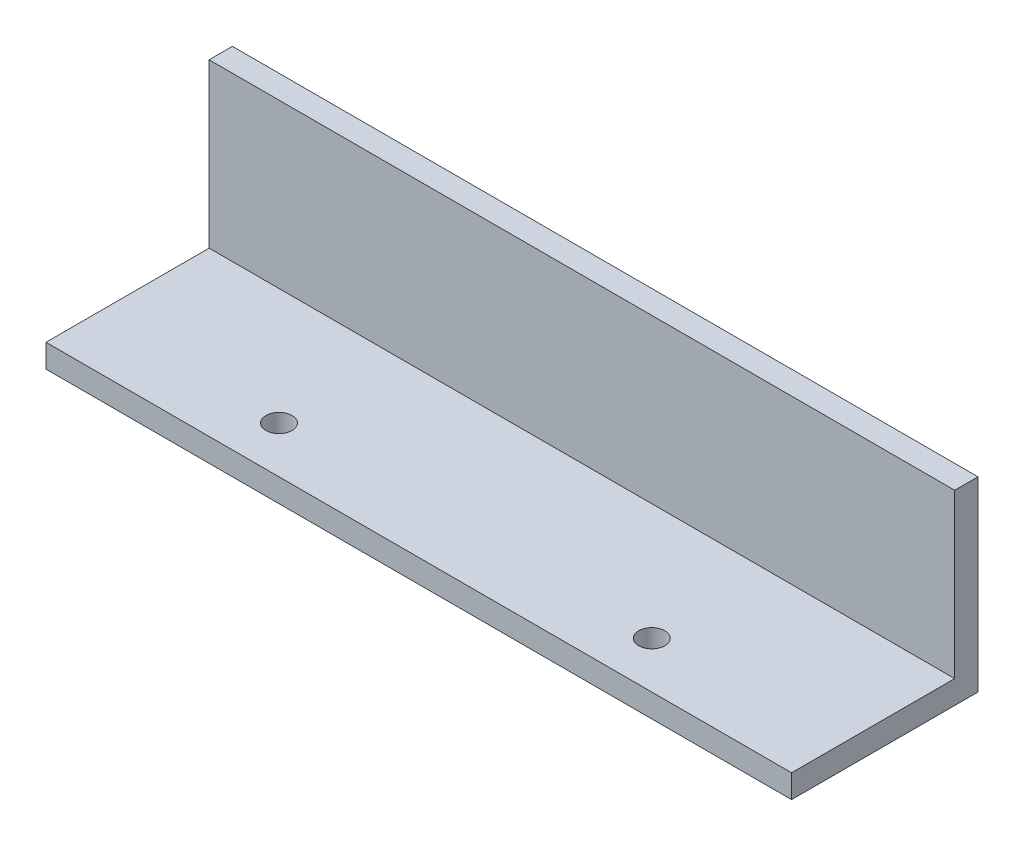
ISO-10303-21;
HEADER;
FILE_DESCRIPTION(('STEP AP214'),'2;1');
FILE_NAME('part.step','',(''),(''),'','','');
FILE_SCHEMA(('AUTOMOTIVE_DESIGN { 1 0 10303 214 1 1 1 1 }'));
ENDSEC;
DATA;
#1=APPLICATION_CONTEXT('core data for automotive mechanical design processes');
#2=APPLICATION_PROTOCOL_DEFINITION('international standard','automotive_design',2000,#1);
#3=PRODUCT_CONTEXT('',#1,'mechanical');
#4=PRODUCT('Part','Part','',(#3));
#5=PRODUCT_RELATED_PRODUCT_CATEGORY('part','',(#4));
#6=PRODUCT_DEFINITION_FORMATION('','',#4);
#7=PRODUCT_DEFINITION_CONTEXT('part definition',#1,'design');
#8=PRODUCT_DEFINITION('design','',#6,#7);
#9=PRODUCT_DEFINITION_SHAPE('','',#8);
#10=(LENGTH_UNIT() NAMED_UNIT(*) SI_UNIT(.MILLI.,.METRE.));
#11=(NAMED_UNIT(*) PLANE_ANGLE_UNIT() SI_UNIT($,.RADIAN.));
#12=(NAMED_UNIT(*) SI_UNIT($,.STERADIAN.) SOLID_ANGLE_UNIT());
#13=UNCERTAINTY_MEASURE_WITH_UNIT(LENGTH_MEASURE(1.E-05),#10,'distance_accuracy_value','');
#14=(GEOMETRIC_REPRESENTATION_CONTEXT(3) GLOBAL_UNCERTAINTY_ASSIGNED_CONTEXT((#13)) GLOBAL_UNIT_ASSIGNED_CONTEXT((#10,
#11,#12)) REPRESENTATION_CONTEXT('',''));
#15=CARTESIAN_POINT('',(0.,0.,0.));
#16=DIRECTION('',(0.,0.,1.));
#17=DIRECTION('',(1.,0.,0.));
#18=AXIS2_PLACEMENT_3D('',#15,#16,#17);
#19=CARTESIAN_POINT('',(0.,3.175,0.));
#20=DIRECTION('',(0.,-1.,0.));
#21=DIRECTION('',(0.,0.,-1.));
#22=AXIS2_PLACEMENT_3D('',#19,#20,#21);
#23=PLANE('',#22);
#24=CARTESIAN_POINT('',(25.4,3.175,-31.75));
#25=DIRECTION('',(0.,-1.,0.));
#26=DIRECTION('',(0.,0.,-1.));
#27=AXIS2_PLACEMENT_3D('',#24,#25,#26);
#28=CIRCLE('',#27,1.778);
#29=CARTESIAN_POINT('',(25.4,3.175,-33.528));
#30=VERTEX_POINT('',#29);
#31=EDGE_CURVE('E148',#30,#30,#28,.T.);
#32=ORIENTED_EDGE('',*,*,#31,.T.);
#33=EDGE_LOOP('',(#32));
#34=FACE_BOUND('',#33,.T.);
#35=CARTESIAN_POINT('',(76.2,3.175,-31.75));
#36=DIRECTION('',(0.,-1.,0.));
#37=DIRECTION('',(0.,0.,-1.));
#38=AXIS2_PLACEMENT_3D('',#35,#36,#37);
#39=CIRCLE('',#38,1.77800000000001);
#40=CARTESIAN_POINT('',(76.2,3.175,-33.528));
#41=VERTEX_POINT('',#40);
#42=EDGE_CURVE('E154',#41,#41,#39,.T.);
#43=ORIENTED_EDGE('',*,*,#42,.T.);
#44=EDGE_LOOP('',(#43));
#45=FACE_BOUND('',#44,.T.);
#46=DIRECTION('',(-1.,0.,0.));
#47=VECTOR('',#46,1.);
#48=CARTESIAN_POINT('',(101.6,3.175,-25.4));
#49=LINE('',#48,#47);
#50=CARTESIAN_POINT('',(101.6,3.175,-25.4));
#51=VERTEX_POINT('',#50);
#52=CARTESIAN_POINT('',(0.,3.175,-25.4));
#53=VERTEX_POINT('',#52);
#54=EDGE_CURVE('E93',#51,#53,#49,.T.);
#55=ORIENTED_EDGE('',*,*,#54,.F.);
#56=DIRECTION('',(0.,0.,-1.));
#57=VECTOR('',#56,1.);
#58=CARTESIAN_POINT('',(101.6,3.175,0.));
#59=LINE('',#58,#57);
#60=CARTESIAN_POINT('',(101.6,3.175,-47.625));
#61=VERTEX_POINT('',#60);
#62=EDGE_CURVE('E39',#51,#61,#59,.T.);
#63=ORIENTED_EDGE('',*,*,#62,.T.);
#64=DIRECTION('',(1.,0.,0.));
#65=VECTOR('',#64,1.);
#66=CARTESIAN_POINT('',(0.,3.175,-47.625));
#67=LINE('',#66,#65);
#68=CARTESIAN_POINT('',(0.,3.175,-47.625));
#69=VERTEX_POINT('',#68);
#70=EDGE_CURVE('E61',#69,#61,#67,.T.);
#71=ORIENTED_EDGE('',*,*,#70,.F.);
#72=DIRECTION('',(0.,0.,1.));
#73=VECTOR('',#72,1.);
#74=CARTESIAN_POINT('',(0.,3.175,0.));
#75=LINE('',#74,#73);
#76=EDGE_CURVE('E99',#69,#53,#75,.T.);
#77=ORIENTED_EDGE('',*,*,#76,.T.);
#78=EDGE_LOOP('',(#55,#63,#71,#77));
#79=FACE_BOUND('',#78,.T.);
#80=ADVANCED_FACE('F35',(#34,#45,#79),#23,.F.);
#81=CARTESIAN_POINT('',(0.,3.175,0.));
#82=DIRECTION('',(1.,0.,0.));
#83=DIRECTION('',(0.,0.,-1.));
#84=AXIS2_PLACEMENT_3D('',#81,#82,#83);
#85=PLANE('',#84);
#86=DIRECTION('',(0.,-1.,0.));
#87=VECTOR('',#86,1.);
#88=CARTESIAN_POINT('',(0.,0.,-25.4));
#89=LINE('',#88,#87);
#90=CARTESIAN_POINT('',(0.,0.,-25.4));
#91=VERTEX_POINT('',#90);
#92=EDGE_CURVE('E53',#53,#91,#89,.T.);
#93=ORIENTED_EDGE('',*,*,#92,.F.);
#94=ORIENTED_EDGE('',*,*,#76,.F.);
#95=DIRECTION('',(0.,-1.,0.));
#96=VECTOR('',#95,1.);
#97=CARTESIAN_POINT('',(0.,25.4,-47.625));
#98=LINE('',#97,#96);
#99=CARTESIAN_POINT('',(0.,25.4,-47.625));
#100=VERTEX_POINT('',#99);
#101=EDGE_CURVE('E124',#100,#69,#98,.T.);
#102=ORIENTED_EDGE('',*,*,#101,.F.);
#103=DIRECTION('',(0.,0.,1.));
#104=VECTOR('',#103,1.);
#105=CARTESIAN_POINT('',(0.,25.4,-50.8));
#106=LINE('',#105,#104);
#107=CARTESIAN_POINT('',(0.,25.4,-50.8));
#108=VERTEX_POINT('',#107);
#109=EDGE_CURVE('E139',#108,#100,#106,.T.);
#110=ORIENTED_EDGE('',*,*,#109,.F.);
#111=DIRECTION('',(0.,-1.,0.));
#112=VECTOR('',#111,1.);
#113=CARTESIAN_POINT('',(0.,3.175,-50.8));
#114=LINE('',#113,#112);
#115=CARTESIAN_POINT('',(0.,0.,-50.8));
#116=VERTEX_POINT('',#115);
#117=EDGE_CURVE('E45',#108,#116,#114,.T.);
#118=ORIENTED_EDGE('',*,*,#117,.T.);
#119=DIRECTION('',(0.,0.,1.));
#120=VECTOR('',#119,1.);
#121=CARTESIAN_POINT('',(0.,0.,0.));
#122=LINE('',#121,#120);
#123=EDGE_CURVE('E121',#116,#91,#122,.T.);
#124=ORIENTED_EDGE('',*,*,#123,.T.);
#125=EDGE_LOOP('',(#93,#94,#102,#110,#118,#124));
#126=FACE_BOUND('',#125,.T.);
#127=ADVANCED_FACE('F37',(#126),#85,.F.);
#128=CARTESIAN_POINT('',(101.6,3.175,0.));
#129=DIRECTION('',(-1.,0.,0.));
#130=DIRECTION('',(0.,0.,1.));
#131=AXIS2_PLACEMENT_3D('',#128,#129,#130);
#132=PLANE('',#131);
#133=DIRECTION('',(0.,1.,0.));
#134=VECTOR('',#133,1.);
#135=CARTESIAN_POINT('',(101.6,0.,-25.4));
#136=LINE('',#135,#134);
#137=CARTESIAN_POINT('',(101.6,0.,-25.4));
#138=VERTEX_POINT('',#137);
#139=EDGE_CURVE('E90',#138,#51,#136,.T.);
#140=ORIENTED_EDGE('',*,*,#139,.F.);
#141=DIRECTION('',(0.,0.,-1.));
#142=VECTOR('',#141,1.);
#143=CARTESIAN_POINT('',(101.6,0.,0.));
#144=LINE('',#143,#142);
#145=CARTESIAN_POINT('',(101.6,0.,-50.8));
#146=VERTEX_POINT('',#145);
#147=EDGE_CURVE('E110',#138,#146,#144,.T.);
#148=ORIENTED_EDGE('',*,*,#147,.T.);
#149=DIRECTION('',(0.,-1.,0.));
#150=VECTOR('',#149,1.);
#151=CARTESIAN_POINT('',(101.6,3.175,-50.8));
#152=LINE('',#151,#150);
#153=CARTESIAN_POINT('',(101.6,25.4,-50.8));
#154=VERTEX_POINT('',#153);
#155=EDGE_CURVE('E11',#154,#146,#152,.T.);
#156=ORIENTED_EDGE('',*,*,#155,.F.);
#157=DIRECTION('',(0.,0.,-1.));
#158=VECTOR('',#157,1.);
#159=CARTESIAN_POINT('',(101.6,25.4,-50.8));
#160=LINE('',#159,#158);
#161=CARTESIAN_POINT('',(101.6,25.4,-47.625));
#162=VERTEX_POINT('',#161);
#163=EDGE_CURVE('E142',#162,#154,#160,.T.);
#164=ORIENTED_EDGE('',*,*,#163,.F.);
#165=DIRECTION('',(0.,-1.,0.));
#166=VECTOR('',#165,1.);
#167=CARTESIAN_POINT('',(101.6,25.4,-47.625));
#168=LINE('',#167,#166);
#169=EDGE_CURVE('E105',#162,#61,#168,.T.);
#170=ORIENTED_EDGE('',*,*,#169,.T.);
#171=ORIENTED_EDGE('',*,*,#62,.F.);
#172=EDGE_LOOP('',(#140,#148,#156,#164,#170,#171));
#173=FACE_BOUND('',#172,.T.);
#174=ADVANCED_FACE('F102',(#173),#132,.F.);
#175=CARTESIAN_POINT('',(0.,0.,0.));
#176=DIRECTION('',(0.,-1.,0.));
#177=DIRECTION('',(0.,0.,-1.));
#178=AXIS2_PLACEMENT_3D('',#175,#176,#177);
#179=PLANE('',#178);
#180=CARTESIAN_POINT('',(76.2,0.,-31.75));
#181=DIRECTION('',(0.,-1.,0.));
#182=DIRECTION('',(0.,0.,-1.));
#183=AXIS2_PLACEMENT_3D('',#180,#181,#182);
#184=CIRCLE('',#183,1.77800000000001);
#185=CARTESIAN_POINT('',(76.2,0.,-33.528));
#186=VERTEX_POINT('',#185);
#187=EDGE_CURVE('E157',#186,#186,#184,.T.);
#188=ORIENTED_EDGE('',*,*,#187,.F.);
#189=EDGE_LOOP('',(#188));
#190=FACE_BOUND('',#189,.T.);
#191=CARTESIAN_POINT('',(25.4,0.,-31.75));
#192=DIRECTION('',(0.,-1.,0.));
#193=DIRECTION('',(0.,0.,-1.));
#194=AXIS2_PLACEMENT_3D('',#191,#192,#193);
#195=CIRCLE('',#194,1.778);
#196=CARTESIAN_POINT('',(25.4,0.,-33.528));
#197=VERTEX_POINT('',#196);
#198=EDGE_CURVE('E151',#197,#197,#195,.T.);
#199=ORIENTED_EDGE('',*,*,#198,.F.);
#200=EDGE_LOOP('',(#199));
#201=FACE_BOUND('',#200,.T.);
#202=ORIENTED_EDGE('',*,*,#147,.F.);
#203=DIRECTION('',(1.,0.,0.));
#204=VECTOR('',#203,1.);
#205=CARTESIAN_POINT('',(101.6,0.,-25.4));
#206=LINE('',#205,#204);
#207=EDGE_CURVE('E94',#91,#138,#206,.T.);
#208=ORIENTED_EDGE('',*,*,#207,.F.);
#209=ORIENTED_EDGE('',*,*,#123,.F.);
#210=DIRECTION('',(-1.,0.,0.));
#211=VECTOR('',#210,1.);
#212=CARTESIAN_POINT('',(0.,0.,-50.8));
#213=LINE('',#212,#211);
#214=EDGE_CURVE('E108',#146,#116,#213,.T.);
#215=ORIENTED_EDGE('',*,*,#214,.F.);
#216=EDGE_LOOP('',(#202,#208,#209,#215));
#217=FACE_BOUND('',#216,.T.);
#218=ADVANCED_FACE('F134',(#190,#201,#217),#179,.T.);
#219=CARTESIAN_POINT('',(0.,3.175,-50.8));
#220=DIRECTION('',(0.,0.,1.));
#221=DIRECTION('',(1.,0.,0.));
#222=AXIS2_PLACEMENT_3D('',#219,#220,#221);
#223=PLANE('',#222);
#224=ORIENTED_EDGE('',*,*,#214,.T.);
#225=ORIENTED_EDGE('',*,*,#117,.F.);
#226=DIRECTION('',(-1.,0.,0.));
#227=VECTOR('',#226,1.);
#228=CARTESIAN_POINT('',(0.,25.4,-50.8));
#229=LINE('',#228,#227);
#230=EDGE_CURVE('E132',#154,#108,#229,.T.);
#231=ORIENTED_EDGE('',*,*,#230,.F.);
#232=ORIENTED_EDGE('',*,*,#155,.T.);
#233=EDGE_LOOP('',(#224,#225,#231,#232));
#234=FACE_BOUND('',#233,.T.);
#235=ADVANCED_FACE('F130',(#234),#223,.F.);
#236=CARTESIAN_POINT('',(0.,25.4,-47.625));
#237=DIRECTION('',(0.,0.,-1.));
#238=DIRECTION('',(-1.,0.,0.));
#239=AXIS2_PLACEMENT_3D('',#236,#237,#238);
#240=PLANE('',#239);
#241=ORIENTED_EDGE('',*,*,#70,.T.);
#242=ORIENTED_EDGE('',*,*,#169,.F.);
#243=DIRECTION('',(1.,0.,0.));
#244=VECTOR('',#243,1.);
#245=CARTESIAN_POINT('',(0.,25.4,-47.625));
#246=LINE('',#245,#244);
#247=EDGE_CURVE('E143',#100,#162,#246,.T.);
#248=ORIENTED_EDGE('',*,*,#247,.F.);
#249=ORIENTED_EDGE('',*,*,#101,.T.);
#250=EDGE_LOOP('',(#241,#242,#248,#249));
#251=FACE_BOUND('',#250,.T.);
#252=ADVANCED_FACE('F190',(#251),#240,.F.);
#253=CARTESIAN_POINT('',(0.,25.4,0.));
#254=DIRECTION('',(0.,1.,0.));
#255=DIRECTION('',(0.,0.,1.));
#256=AXIS2_PLACEMENT_3D('',#253,#254,#255);
#257=PLANE('',#256);
#258=ORIENTED_EDGE('',*,*,#109,.T.);
#259=ORIENTED_EDGE('',*,*,#247,.T.);
#260=ORIENTED_EDGE('',*,*,#163,.T.);
#261=ORIENTED_EDGE('',*,*,#230,.T.);
#262=EDGE_LOOP('',(#258,#259,#260,#261));
#263=FACE_BOUND('',#262,.T.);
#264=ADVANCED_FACE('F141',(#263),#257,.T.);
#265=CARTESIAN_POINT('',(25.4,25.400025,-31.75));
#266=DIRECTION('',(0.,-1.,0.));
#267=DIRECTION('',(0.,0.,-1.));
#268=AXIS2_PLACEMENT_3D('',#265,#266,#267);
#269=CYLINDRICAL_SURFACE('',#268,1.778);
#270=ORIENTED_EDGE('',*,*,#198,.T.);
#271=EDGE_LOOP('',(#270));
#272=FACE_BOUND('',#271,.T.);
#273=ORIENTED_EDGE('',*,*,#31,.F.);
#274=EDGE_LOOP('',(#273));
#275=FACE_BOUND('',#274,.T.);
#276=ADVANCED_FACE('F171',(#272,#275),#269,.F.);
#277=CARTESIAN_POINT('',(76.2,22.225,-31.75));
#278=DIRECTION('',(0.,-1.,0.));
#279=DIRECTION('',(0.,0.,-1.));
#280=AXIS2_PLACEMENT_3D('',#277,#278,#279);
#281=CYLINDRICAL_SURFACE('',#280,1.77800000000001);
#282=ORIENTED_EDGE('',*,*,#187,.T.);
#283=EDGE_LOOP('',(#282));
#284=FACE_BOUND('',#283,.T.);
#285=ORIENTED_EDGE('',*,*,#42,.F.);
#286=EDGE_LOOP('',(#285));
#287=FACE_BOUND('',#286,.T.);
#288=ADVANCED_FACE('F163',(#284,#287),#281,.F.);
#289=CARTESIAN_POINT('',(0.,0.,-25.4));
#290=DIRECTION('',(0.,0.,1.));
#291=DIRECTION('',(1.,0.,0.));
#292=AXIS2_PLACEMENT_3D('',#289,#290,#291);
#293=PLANE('',#292);
#294=ORIENTED_EDGE('',*,*,#139,.T.);
#295=ORIENTED_EDGE('',*,*,#54,.T.);
#296=ORIENTED_EDGE('',*,*,#92,.T.);
#297=ORIENTED_EDGE('',*,*,#207,.T.);
#298=EDGE_LOOP('',(#294,#295,#296,#297));
#299=FACE_BOUND('',#298,.T.);
#300=ADVANCED_FACE('F92',(#299),#293,.T.);
#301=CLOSED_SHELL('',(#80,#127,#174,#218,#235,#252,#264,#276,#288,#300));
#302=MANIFOLD_SOLID_BREP('B2',#301);
#303=ADVANCED_BREP_SHAPE_REPRESENTATION('',(#18,#302),#14);
#304=SHAPE_DEFINITION_REPRESENTATION(#9,#303);
ENDSEC;
END-ISO-10303-21;
